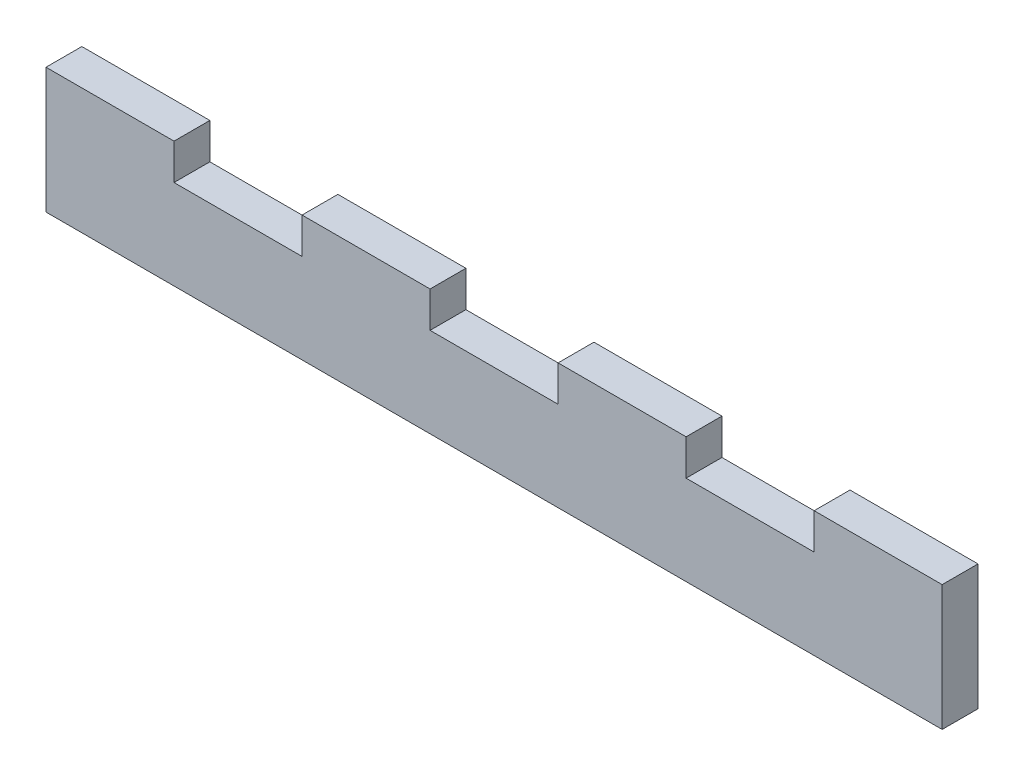
ISO-10303-21;
HEADER;
FILE_DESCRIPTION(('STEP AP214'),'2;1');
FILE_NAME('part.step','',(''),(''),'','','');
FILE_SCHEMA(('AUTOMOTIVE_DESIGN { 1 0 10303 214 1 1 1 1 }'));
ENDSEC;
DATA;
#1=APPLICATION_CONTEXT('core data for automotive mechanical design processes');
#2=APPLICATION_PROTOCOL_DEFINITION('international standard','automotive_design',2000,#1);
#3=PRODUCT_CONTEXT('',#1,'mechanical');
#4=PRODUCT('Part','Part','',(#3));
#5=PRODUCT_RELATED_PRODUCT_CATEGORY('part','',(#4));
#6=PRODUCT_DEFINITION_FORMATION('','',#4);
#7=PRODUCT_DEFINITION_CONTEXT('part definition',#1,'design');
#8=PRODUCT_DEFINITION('design','',#6,#7);
#9=PRODUCT_DEFINITION_SHAPE('','',#8);
#10=(LENGTH_UNIT() NAMED_UNIT(*) SI_UNIT(.MILLI.,.METRE.));
#11=(NAMED_UNIT(*) PLANE_ANGLE_UNIT() SI_UNIT($,.RADIAN.));
#12=(NAMED_UNIT(*) SI_UNIT($,.STERADIAN.) SOLID_ANGLE_UNIT());
#13=UNCERTAINTY_MEASURE_WITH_UNIT(LENGTH_MEASURE(1.E-05),#10,'distance_accuracy_value','');
#14=(GEOMETRIC_REPRESENTATION_CONTEXT(3) GLOBAL_UNCERTAINTY_ASSIGNED_CONTEXT((#13)) GLOBAL_UNIT_ASSIGNED_CONTEXT((#10,
#11,#12)) REPRESENTATION_CONTEXT('',''));
#15=CARTESIAN_POINT('',(0.,0.,0.));
#16=DIRECTION('',(0.,0.,1.));
#17=DIRECTION('',(1.,0.,0.));
#18=AXIS2_PLACEMENT_3D('',#15,#16,#17);
#19=CARTESIAN_POINT('',(63.5,8.89000000000001,5.08));
#20=DIRECTION('',(0.,-1.,0.));
#21=DIRECTION('',(1.,0.,0.));
#22=AXIS2_PLACEMENT_3D('',#19,#20,#21);
#23=PLANE('',#22);
#24=DIRECTION('',(-1.,0.,0.));
#25=VECTOR('',#24,1.);
#26=CARTESIAN_POINT('',(63.5,8.89000000000001,0.));
#27=LINE('',#26,#25);
#28=CARTESIAN_POINT('',(63.5,8.89000000000001,0.));
#29=VERTEX_POINT('',#28);
#30=CARTESIAN_POINT('',(45.3571428571429,8.89,0.));
#31=VERTEX_POINT('',#30);
#32=EDGE_CURVE('E226',#29,#31,#27,.T.);
#33=ORIENTED_EDGE('',*,*,#32,.T.);
#34=DIRECTION('',(0.,0.,-1.));
#35=VECTOR('',#34,1.);
#36=CARTESIAN_POINT('',(45.3571428571429,8.89,5.08));
#37=LINE('',#36,#35);
#38=CARTESIAN_POINT('',(45.3571428571429,8.89,5.08));
#39=VERTEX_POINT('',#38);
#40=EDGE_CURVE('E191',#39,#31,#37,.T.);
#41=ORIENTED_EDGE('',*,*,#40,.F.);
#42=DIRECTION('',(-1.,0.,0.));
#43=VECTOR('',#42,1.);
#44=CARTESIAN_POINT('',(63.5,8.89000000000001,5.08));
#45=LINE('',#44,#43);
#46=CARTESIAN_POINT('',(63.5,8.89000000000001,5.08));
#47=VERTEX_POINT('',#46);
#48=EDGE_CURVE('E231',#47,#39,#45,.T.);
#49=ORIENTED_EDGE('',*,*,#48,.F.);
#50=DIRECTION('',(0.,0.,-1.));
#51=VECTOR('',#50,1.);
#52=CARTESIAN_POINT('',(63.5,8.89000000000001,5.08));
#53=LINE('',#52,#51);
#54=EDGE_CURVE('E248',#47,#29,#53,.T.);
#55=ORIENTED_EDGE('',*,*,#54,.T.);
#56=EDGE_LOOP('',(#33,#41,#49,#55));
#57=FACE_BOUND('',#56,.T.);
#58=ADVANCED_FACE('F33',(#57),#23,.F.);
#59=CARTESIAN_POINT('',(27.2142857142857,8.89,5.08));
#60=VERTEX_POINT('',#59);
#61=CARTESIAN_POINT('',(9.0714285714286,8.89,5.08));
#62=VERTEX_POINT('',#61);
#63=EDGE_CURVE('E235',#60,#62,#45,.T.);
#64=ORIENTED_EDGE('',*,*,#63,.F.);
#65=DIRECTION('',(0.,0.,1.));
#66=VECTOR('',#65,1.);
#67=CARTESIAN_POINT('',(27.2142857142857,8.89,5.08));
#68=LINE('',#67,#66);
#69=CARTESIAN_POINT('',(27.2142857142857,8.89,0.));
#70=VERTEX_POINT('',#69);
#71=EDGE_CURVE('E287',#70,#60,#68,.T.);
#72=ORIENTED_EDGE('',*,*,#71,.F.);
#73=CARTESIAN_POINT('',(9.07142857142859,8.89,0.));
#74=VERTEX_POINT('',#73);
#75=EDGE_CURVE('E167',#70,#74,#27,.T.);
#76=ORIENTED_EDGE('',*,*,#75,.T.);
#77=DIRECTION('',(0.,0.,-1.));
#78=VECTOR('',#77,1.);
#79=CARTESIAN_POINT('',(9.0714285714286,8.89,5.08));
#80=LINE('',#79,#78);
#81=EDGE_CURVE('E185',#62,#74,#80,.T.);
#82=ORIENTED_EDGE('',*,*,#81,.F.);
#83=EDGE_LOOP('',(#64,#72,#76,#82));
#84=FACE_BOUND('',#83,.T.);
#85=ADVANCED_FACE('F285',(#84),#23,.F.);
#86=CARTESIAN_POINT('',(-9.07142857142854,8.89,5.08));
#87=VERTEX_POINT('',#86);
#88=CARTESIAN_POINT('',(-27.2142857142857,8.88999999999999,5.08));
#89=VERTEX_POINT('',#88);
#90=EDGE_CURVE('E296',#87,#89,#45,.T.);
#91=ORIENTED_EDGE('',*,*,#90,.F.);
#92=DIRECTION('',(0.,0.,1.));
#93=VECTOR('',#92,1.);
#94=CARTESIAN_POINT('',(-9.07142857142854,8.89,5.08));
#95=LINE('',#94,#93);
#96=CARTESIAN_POINT('',(-9.07142857142856,8.89,0.));
#97=VERTEX_POINT('',#96);
#98=EDGE_CURVE('E177',#97,#87,#95,.T.);
#99=ORIENTED_EDGE('',*,*,#98,.F.);
#100=CARTESIAN_POINT('',(-27.2142857142857,8.88999999999999,0.));
#101=VERTEX_POINT('',#100);
#102=EDGE_CURVE('E276',#97,#101,#27,.T.);
#103=ORIENTED_EDGE('',*,*,#102,.T.);
#104=DIRECTION('',(0.,0.,-1.));
#105=VECTOR('',#104,1.);
#106=CARTESIAN_POINT('',(-27.2142857142857,8.88999999999999,5.08));
#107=LINE('',#106,#105);
#108=EDGE_CURVE('E211',#89,#101,#107,.T.);
#109=ORIENTED_EDGE('',*,*,#108,.F.);
#110=EDGE_LOOP('',(#91,#99,#103,#109));
#111=FACE_BOUND('',#110,.T.);
#112=ADVANCED_FACE('F305',(#111),#23,.F.);
#113=CARTESIAN_POINT('',(-63.5,-8.89000000000001,5.08));
#114=DIRECTION('',(1.,0.,0.));
#115=DIRECTION('',(0.,0.,-1.));
#116=AXIS2_PLACEMENT_3D('',#113,#114,#115);
#117=PLANE('',#116);
#118=DIRECTION('',(0.,-1.,0.));
#119=VECTOR('',#118,1.);
#120=CARTESIAN_POINT('',(-63.5,-8.89000000000001,0.));
#121=LINE('',#120,#119);
#122=CARTESIAN_POINT('',(-63.5,8.88999999999999,0.));
#123=VERTEX_POINT('',#122);
#124=CARTESIAN_POINT('',(-63.5,-8.89000000000001,0.));
#125=VERTEX_POINT('',#124);
#126=EDGE_CURVE('E236',#123,#125,#121,.T.);
#127=ORIENTED_EDGE('',*,*,#126,.T.);
#128=DIRECTION('',(0.,0.,-1.));
#129=VECTOR('',#128,1.);
#130=CARTESIAN_POINT('',(-63.5,-8.89000000000001,5.08));
#131=LINE('',#130,#129);
#132=CARTESIAN_POINT('',(-63.5,-8.89000000000001,5.08));
#133=VERTEX_POINT('',#132);
#134=EDGE_CURVE('E11',#133,#125,#131,.T.);
#135=ORIENTED_EDGE('',*,*,#134,.F.);
#136=DIRECTION('',(0.,-1.,0.));
#137=VECTOR('',#136,1.);
#138=CARTESIAN_POINT('',(-63.5,-8.89000000000001,5.08));
#139=LINE('',#138,#137);
#140=CARTESIAN_POINT('',(-63.5,8.88999999999999,5.08));
#141=VERTEX_POINT('',#140);
#142=EDGE_CURVE('E222',#141,#133,#139,.T.);
#143=ORIENTED_EDGE('',*,*,#142,.F.);
#144=DIRECTION('',(0.,0.,-1.));
#145=VECTOR('',#144,1.);
#146=CARTESIAN_POINT('',(-63.5,8.88999999999999,5.08));
#147=LINE('',#146,#145);
#148=EDGE_CURVE('E234',#141,#123,#147,.T.);
#149=ORIENTED_EDGE('',*,*,#148,.T.);
#150=EDGE_LOOP('',(#127,#135,#143,#149));
#151=FACE_BOUND('',#150,.T.);
#152=ADVANCED_FACE('F35',(#151),#117,.F.);
#153=CARTESIAN_POINT('',(63.5,-8.88999999999999,5.08));
#154=DIRECTION('',(0.,1.,0.));
#155=DIRECTION('',(-1.,0.,0.));
#156=AXIS2_PLACEMENT_3D('',#153,#154,#155);
#157=PLANE('',#156);
#158=DIRECTION('',(1.,0.,0.));
#159=VECTOR('',#158,1.);
#160=CARTESIAN_POINT('',(63.5,-8.88999999999999,0.));
#161=LINE('',#160,#159);
#162=CARTESIAN_POINT('',(63.5,-8.88999999999999,0.));
#163=VERTEX_POINT('',#162);
#164=EDGE_CURVE('E239',#125,#163,#161,.T.);
#165=ORIENTED_EDGE('',*,*,#164,.T.);
#166=DIRECTION('',(0.,0.,-1.));
#167=VECTOR('',#166,1.);
#168=CARTESIAN_POINT('',(63.5,-8.88999999999999,5.08));
#169=LINE('',#168,#167);
#170=CARTESIAN_POINT('',(63.5,-8.88999999999999,5.08));
#171=VERTEX_POINT('',#170);
#172=EDGE_CURVE('E41',#171,#163,#169,.T.);
#173=ORIENTED_EDGE('',*,*,#172,.F.);
#174=DIRECTION('',(1.,0.,0.));
#175=VECTOR('',#174,1.);
#176=CARTESIAN_POINT('',(63.5,-8.88999999999999,5.08));
#177=LINE('',#176,#175);
#178=EDGE_CURVE('E225',#133,#171,#177,.T.);
#179=ORIENTED_EDGE('',*,*,#178,.F.);
#180=ORIENTED_EDGE('',*,*,#134,.T.);
#181=EDGE_LOOP('',(#165,#173,#179,#180));
#182=FACE_BOUND('',#181,.T.);
#183=ADVANCED_FACE('F268',(#182),#157,.F.);
#184=CARTESIAN_POINT('',(63.5,-8.88999999999999,5.08));
#185=DIRECTION('',(-1.,0.,0.));
#186=DIRECTION('',(0.,0.,1.));
#187=AXIS2_PLACEMENT_3D('',#184,#185,#186);
#188=PLANE('',#187);
#189=DIRECTION('',(0.,1.,0.));
#190=VECTOR('',#189,1.);
#191=CARTESIAN_POINT('',(63.5,-8.88999999999999,0.));
#192=LINE('',#191,#190);
#193=EDGE_CURVE('E241',#163,#29,#192,.T.);
#194=ORIENTED_EDGE('',*,*,#193,.T.);
#195=ORIENTED_EDGE('',*,*,#54,.F.);
#196=DIRECTION('',(0.,1.,0.));
#197=VECTOR('',#196,1.);
#198=CARTESIAN_POINT('',(63.5,-8.88999999999999,5.08));
#199=LINE('',#198,#197);
#200=EDGE_CURVE('E228',#171,#47,#199,.T.);
#201=ORIENTED_EDGE('',*,*,#200,.F.);
#202=ORIENTED_EDGE('',*,*,#172,.T.);
#203=EDGE_LOOP('',(#194,#195,#201,#202));
#204=FACE_BOUND('',#203,.T.);
#205=ADVANCED_FACE('F255',(#204),#188,.F.);
#206=CARTESIAN_POINT('',(-45.3571428571428,8.88999999999999,5.08));
#207=VERTEX_POINT('',#206);
#208=EDGE_CURVE('E230',#207,#141,#45,.T.);
#209=ORIENTED_EDGE('',*,*,#208,.F.);
#210=DIRECTION('',(0.,0.,1.));
#211=VECTOR('',#210,1.);
#212=CARTESIAN_POINT('',(-45.3571428571428,8.88999999999999,5.08));
#213=LINE('',#212,#211);
#214=CARTESIAN_POINT('',(-45.3571428571428,8.88999999999999,0.));
#215=VERTEX_POINT('',#214);
#216=EDGE_CURVE('E201',#215,#207,#213,.T.);
#217=ORIENTED_EDGE('',*,*,#216,.F.);
#218=EDGE_CURVE('E243',#215,#123,#27,.T.);
#219=ORIENTED_EDGE('',*,*,#218,.T.);
#220=ORIENTED_EDGE('',*,*,#148,.F.);
#221=EDGE_LOOP('',(#209,#217,#219,#220));
#222=FACE_BOUND('',#221,.T.);
#223=ADVANCED_FACE('F302',(#222),#23,.F.);
#224=CARTESIAN_POINT('',(0.,0.,5.08));
#225=DIRECTION('',(0.,0.,1.));
#226=DIRECTION('',(1.,0.,0.));
#227=AXIS2_PLACEMENT_3D('',#224,#225,#226);
#228=PLANE('',#227);
#229=DIRECTION('',(0.,1.,0.));
#230=VECTOR('',#229,1.);
#231=CARTESIAN_POINT('',(45.3571428571429,3.81,5.08));
#232=LINE('',#231,#230);
#233=CARTESIAN_POINT('',(45.3571428571429,3.81,5.08));
#234=VERTEX_POINT('',#233);
#235=EDGE_CURVE('E170',#234,#39,#232,.T.);
#236=ORIENTED_EDGE('',*,*,#235,.F.);
#237=DIRECTION('',(1.,0.,0.));
#238=VECTOR('',#237,1.);
#239=CARTESIAN_POINT('',(45.3571428571429,3.81,5.08));
#240=LINE('',#239,#238);
#241=CARTESIAN_POINT('',(27.2142857142857,3.81,5.08));
#242=VERTEX_POINT('',#241);
#243=EDGE_CURVE('E155',#242,#234,#240,.T.);
#244=ORIENTED_EDGE('',*,*,#243,.F.);
#245=DIRECTION('',(0.,1.,0.));
#246=VECTOR('',#245,1.);
#247=CARTESIAN_POINT('',(27.2142857142857,3.81,5.08));
#248=LINE('',#247,#246);
#249=EDGE_CURVE('E153',#242,#60,#248,.T.);
#250=ORIENTED_EDGE('',*,*,#249,.T.);
#251=ORIENTED_EDGE('',*,*,#63,.T.);
#252=DIRECTION('',(0.,1.,0.));
#253=VECTOR('',#252,1.);
#254=CARTESIAN_POINT('',(9.0714285714286,3.81,5.08));
#255=LINE('',#254,#253);
#256=CARTESIAN_POINT('',(9.0714285714286,3.81,5.08));
#257=VERTEX_POINT('',#256);
#258=EDGE_CURVE('E189',#257,#62,#255,.T.);
#259=ORIENTED_EDGE('',*,*,#258,.F.);
#260=DIRECTION('',(1.,0.,0.));
#261=VECTOR('',#260,1.);
#262=CARTESIAN_POINT('',(9.0714285714286,3.81,5.08));
#263=LINE('',#262,#261);
#264=CARTESIAN_POINT('',(-9.07142857142854,3.80999999999999,5.08));
#265=VERTEX_POINT('',#264);
#266=EDGE_CURVE('E182',#265,#257,#263,.T.);
#267=ORIENTED_EDGE('',*,*,#266,.F.);
#268=DIRECTION('',(0.,1.,0.));
#269=VECTOR('',#268,1.);
#270=CARTESIAN_POINT('',(-9.07142857142854,3.80999999999999,5.08));
#271=LINE('',#270,#269);
#272=EDGE_CURVE('E192',#265,#87,#271,.T.);
#273=ORIENTED_EDGE('',*,*,#272,.T.);
#274=ORIENTED_EDGE('',*,*,#90,.T.);
#275=DIRECTION('',(0.,1.,0.));
#276=VECTOR('',#275,1.);
#277=CARTESIAN_POINT('',(-27.2142857142857,3.80999999999999,5.08));
#278=LINE('',#277,#276);
#279=CARTESIAN_POINT('',(-27.2142857142857,3.80999999999999,5.08));
#280=VERTEX_POINT('',#279);
#281=EDGE_CURVE('E187',#280,#89,#278,.T.);
#282=ORIENTED_EDGE('',*,*,#281,.F.);
#283=DIRECTION('',(1.,0.,0.));
#284=VECTOR('',#283,1.);
#285=CARTESIAN_POINT('',(-27.2142857142857,3.80999999999999,5.08));
#286=LINE('',#285,#284);
#287=CARTESIAN_POINT('',(-45.3571428571428,3.80999999999999,5.08));
#288=VERTEX_POINT('',#287);
#289=EDGE_CURVE('E207',#288,#280,#286,.T.);
#290=ORIENTED_EDGE('',*,*,#289,.F.);
#291=DIRECTION('',(0.,1.,0.));
#292=VECTOR('',#291,1.);
#293=CARTESIAN_POINT('',(-45.3571428571428,3.80999999999999,5.08));
#294=LINE('',#293,#292);
#295=EDGE_CURVE('E215',#288,#207,#294,.T.);
#296=ORIENTED_EDGE('',*,*,#295,.T.);
#297=ORIENTED_EDGE('',*,*,#208,.T.);
#298=ORIENTED_EDGE('',*,*,#142,.T.);
#299=ORIENTED_EDGE('',*,*,#178,.T.);
#300=ORIENTED_EDGE('',*,*,#200,.T.);
#301=ORIENTED_EDGE('',*,*,#48,.T.);
#302=EDGE_LOOP('',(#236,#244,#250,#251,#259,#267,#273,#274,#282,#290,#296,#297,#298,#299,#300,#301));
#303=FACE_BOUND('',#302,.T.);
#304=ADVANCED_FACE('F265',(#303),#228,.T.);
#305=CARTESIAN_POINT('',(0.,0.,0.));
#306=DIRECTION('',(0.,0.,1.));
#307=DIRECTION('',(1.,0.,0.));
#308=AXIS2_PLACEMENT_3D('',#305,#306,#307);
#309=PLANE('',#308);
#310=DIRECTION('',(-1.,0.,0.));
#311=VECTOR('',#310,1.);
#312=CARTESIAN_POINT('',(45.3571428571429,3.81,0.));
#313=LINE('',#312,#311);
#314=CARTESIAN_POINT('',(45.3571428571429,3.81,0.));
#315=VERTEX_POINT('',#314);
#316=CARTESIAN_POINT('',(27.2142857142857,3.81,0.));
#317=VERTEX_POINT('',#316);
#318=EDGE_CURVE('E156',#315,#317,#313,.T.);
#319=ORIENTED_EDGE('',*,*,#318,.F.);
#320=DIRECTION('',(0.,1.,0.));
#321=VECTOR('',#320,1.);
#322=CARTESIAN_POINT('',(45.3571428571429,3.81,0.));
#323=LINE('',#322,#321);
#324=EDGE_CURVE('E168',#315,#31,#323,.T.);
#325=ORIENTED_EDGE('',*,*,#324,.T.);
#326=ORIENTED_EDGE('',*,*,#32,.F.);
#327=ORIENTED_EDGE('',*,*,#193,.F.);
#328=ORIENTED_EDGE('',*,*,#164,.F.);
#329=ORIENTED_EDGE('',*,*,#126,.F.);
#330=ORIENTED_EDGE('',*,*,#218,.F.);
#331=DIRECTION('',(0.,1.,0.));
#332=VECTOR('',#331,1.);
#333=CARTESIAN_POINT('',(-45.3571428571428,3.80999999999999,0.));
#334=LINE('',#333,#332);
#335=CARTESIAN_POINT('',(-45.3571428571428,3.80999999999999,0.));
#336=VERTEX_POINT('',#335);
#337=EDGE_CURVE('E218',#336,#215,#334,.T.);
#338=ORIENTED_EDGE('',*,*,#337,.F.);
#339=DIRECTION('',(-1.,0.,0.));
#340=VECTOR('',#339,1.);
#341=CARTESIAN_POINT('',(-27.2142857142857,3.80999999999999,0.));
#342=LINE('',#341,#340);
#343=CARTESIAN_POINT('',(-27.2142857142857,3.80999999999999,0.));
#344=VERTEX_POINT('',#343);
#345=EDGE_CURVE('E200',#344,#336,#342,.T.);
#346=ORIENTED_EDGE('',*,*,#345,.F.);
#347=DIRECTION('',(0.,1.,0.));
#348=VECTOR('',#347,1.);
#349=CARTESIAN_POINT('',(-27.2142857142857,3.80999999999999,0.));
#350=LINE('',#349,#348);
#351=EDGE_CURVE('E210',#344,#101,#350,.T.);
#352=ORIENTED_EDGE('',*,*,#351,.T.);
#353=ORIENTED_EDGE('',*,*,#102,.F.);
#354=DIRECTION('',(0.,1.,0.));
#355=VECTOR('',#354,1.);
#356=CARTESIAN_POINT('',(-9.07142857142856,3.80999999999999,0.));
#357=LINE('',#356,#355);
#358=CARTESIAN_POINT('',(-9.07142857142856,3.80999999999999,0.));
#359=VERTEX_POINT('',#358);
#360=EDGE_CURVE('E195',#359,#97,#357,.T.);
#361=ORIENTED_EDGE('',*,*,#360,.F.);
#362=DIRECTION('',(-1.,0.,0.));
#363=VECTOR('',#362,1.);
#364=CARTESIAN_POINT('',(9.07142857142859,3.81,0.));
#365=LINE('',#364,#363);
#366=CARTESIAN_POINT('',(9.0714285714286,3.81,0.));
#367=VERTEX_POINT('',#366);
#368=EDGE_CURVE('E176',#367,#359,#365,.T.);
#369=ORIENTED_EDGE('',*,*,#368,.F.);
#370=DIRECTION('',(0.,1.,0.));
#371=VECTOR('',#370,1.);
#372=CARTESIAN_POINT('',(9.07142857142859,3.81,0.));
#373=LINE('',#372,#371);
#374=EDGE_CURVE('E184',#367,#74,#373,.T.);
#375=ORIENTED_EDGE('',*,*,#374,.T.);
#376=ORIENTED_EDGE('',*,*,#75,.F.);
#377=DIRECTION('',(0.,1.,0.));
#378=VECTOR('',#377,1.);
#379=CARTESIAN_POINT('',(27.2142857142857,3.81,0.));
#380=LINE('',#379,#378);
#381=EDGE_CURVE('E150',#317,#70,#380,.T.);
#382=ORIENTED_EDGE('',*,*,#381,.F.);
#383=EDGE_LOOP('',(#319,#325,#326,#327,#328,#329,#330,#338,#346,#352,#353,#361,#369,#375,#376,#382));
#384=FACE_BOUND('',#383,.T.);
#385=ADVANCED_FACE('F164',(#384),#309,.F.);
#386=CARTESIAN_POINT('',(-27.2142857142857,3.80999999999999,5.08));
#387=DIRECTION('',(1.,0.,0.));
#388=DIRECTION('',(0.,0.,-1.));
#389=AXIS2_PLACEMENT_3D('',#386,#387,#388);
#390=PLANE('',#389);
#391=ORIENTED_EDGE('',*,*,#108,.T.);
#392=ORIENTED_EDGE('',*,*,#351,.F.);
#393=DIRECTION('',(0.,0.,-1.));
#394=VECTOR('',#393,1.);
#395=CARTESIAN_POINT('',(-27.2142857142857,3.80999999999999,5.08));
#396=LINE('',#395,#394);
#397=EDGE_CURVE('E198',#280,#344,#396,.T.);
#398=ORIENTED_EDGE('',*,*,#397,.F.);
#399=ORIENTED_EDGE('',*,*,#281,.T.);
#400=EDGE_LOOP('',(#391,#392,#398,#399));
#401=FACE_BOUND('',#400,.T.);
#402=ADVANCED_FACE('F321',(#401),#390,.F.);
#403=CARTESIAN_POINT('',(-45.3571428571428,3.80999999999999,5.08));
#404=DIRECTION('',(-1.,0.,0.));
#405=DIRECTION('',(0.,0.,1.));
#406=AXIS2_PLACEMENT_3D('',#403,#404,#405);
#407=PLANE('',#406);
#408=ORIENTED_EDGE('',*,*,#216,.T.);
#409=ORIENTED_EDGE('',*,*,#295,.F.);
#410=DIRECTION('',(0.,0.,1.));
#411=VECTOR('',#410,1.);
#412=CARTESIAN_POINT('',(-45.3571428571428,3.80999999999999,5.08));
#413=LINE('',#412,#411);
#414=EDGE_CURVE('E204',#336,#288,#413,.T.);
#415=ORIENTED_EDGE('',*,*,#414,.F.);
#416=ORIENTED_EDGE('',*,*,#337,.T.);
#417=EDGE_LOOP('',(#408,#409,#415,#416));
#418=FACE_BOUND('',#417,.T.);
#419=ADVANCED_FACE('F326',(#418),#407,.F.);
#420=CARTESIAN_POINT('',(0.,3.80999999999999,0.));
#421=DIRECTION('',(0.,1.,0.));
#422=DIRECTION('',(-1.,0.,0.));
#423=AXIS2_PLACEMENT_3D('',#420,#421,#422);
#424=PLANE('',#423);
#425=ORIENTED_EDGE('',*,*,#397,.T.);
#426=ORIENTED_EDGE('',*,*,#345,.T.);
#427=ORIENTED_EDGE('',*,*,#414,.T.);
#428=ORIENTED_EDGE('',*,*,#289,.T.);
#429=EDGE_LOOP('',(#425,#426,#427,#428));
#430=FACE_BOUND('',#429,.T.);
#431=ADVANCED_FACE('F324',(#430),#424,.T.);
#432=CARTESIAN_POINT('',(9.0714285714286,3.81,5.08));
#433=DIRECTION('',(1.,0.,0.));
#434=DIRECTION('',(0.,0.,-1.));
#435=AXIS2_PLACEMENT_3D('',#432,#433,#434);
#436=PLANE('',#435);
#437=ORIENTED_EDGE('',*,*,#81,.T.);
#438=ORIENTED_EDGE('',*,*,#374,.F.);
#439=DIRECTION('',(0.,0.,-1.));
#440=VECTOR('',#439,1.);
#441=CARTESIAN_POINT('',(9.0714285714286,3.81,5.08));
#442=LINE('',#441,#440);
#443=EDGE_CURVE('E56',#257,#367,#442,.T.);
#444=ORIENTED_EDGE('',*,*,#443,.F.);
#445=ORIENTED_EDGE('',*,*,#258,.T.);
#446=EDGE_LOOP('',(#437,#438,#444,#445));
#447=FACE_BOUND('',#446,.T.);
#448=ADVANCED_FACE('F333',(#447),#436,.F.);
#449=CARTESIAN_POINT('',(-9.07142857142854,3.80999999999999,5.08));
#450=DIRECTION('',(-1.,0.,0.));
#451=DIRECTION('',(0.,0.,1.));
#452=AXIS2_PLACEMENT_3D('',#449,#450,#451);
#453=PLANE('',#452);
#454=ORIENTED_EDGE('',*,*,#98,.T.);
#455=ORIENTED_EDGE('',*,*,#272,.F.);
#456=DIRECTION('',(0.,0.,1.));
#457=VECTOR('',#456,1.);
#458=CARTESIAN_POINT('',(-9.07142857142854,3.80999999999999,5.08));
#459=LINE('',#458,#457);
#460=EDGE_CURVE('E179',#359,#265,#459,.T.);
#461=ORIENTED_EDGE('',*,*,#460,.F.);
#462=ORIENTED_EDGE('',*,*,#360,.T.);
#463=EDGE_LOOP('',(#454,#455,#461,#462));
#464=FACE_BOUND('',#463,.T.);
#465=ADVANCED_FACE('F366',(#464),#453,.F.);
#466=CARTESIAN_POINT('',(0.,3.81,0.));
#467=DIRECTION('',(0.,1.,0.));
#468=DIRECTION('',(-1.,0.,0.));
#469=AXIS2_PLACEMENT_3D('',#466,#467,#468);
#470=PLANE('',#469);
#471=ORIENTED_EDGE('',*,*,#443,.T.);
#472=ORIENTED_EDGE('',*,*,#368,.T.);
#473=ORIENTED_EDGE('',*,*,#460,.T.);
#474=ORIENTED_EDGE('',*,*,#266,.T.);
#475=EDGE_LOOP('',(#471,#472,#473,#474));
#476=FACE_BOUND('',#475,.T.);
#477=ADVANCED_FACE('F375',(#476),#470,.T.);
#478=CARTESIAN_POINT('',(45.3571428571429,3.81,5.08));
#479=DIRECTION('',(1.,0.,0.));
#480=DIRECTION('',(0.,0.,-1.));
#481=AXIS2_PLACEMENT_3D('',#478,#479,#480);
#482=PLANE('',#481);
#483=ORIENTED_EDGE('',*,*,#40,.T.);
#484=ORIENTED_EDGE('',*,*,#324,.F.);
#485=DIRECTION('',(0.,0.,-1.));
#486=VECTOR('',#485,1.);
#487=CARTESIAN_POINT('',(45.3571428571429,3.81,5.08));
#488=LINE('',#487,#486);
#489=EDGE_CURVE('E48',#234,#315,#488,.T.);
#490=ORIENTED_EDGE('',*,*,#489,.F.);
#491=ORIENTED_EDGE('',*,*,#235,.T.);
#492=EDGE_LOOP('',(#483,#484,#490,#491));
#493=FACE_BOUND('',#492,.T.);
#494=ADVANCED_FACE('F293',(#493),#482,.F.);
#495=CARTESIAN_POINT('',(27.2142857142857,3.81,5.08));
#496=DIRECTION('',(-1.,0.,0.));
#497=DIRECTION('',(0.,0.,1.));
#498=AXIS2_PLACEMENT_3D('',#495,#496,#497);
#499=PLANE('',#498);
#500=ORIENTED_EDGE('',*,*,#71,.T.);
#501=ORIENTED_EDGE('',*,*,#249,.F.);
#502=DIRECTION('',(0.,0.,1.));
#503=VECTOR('',#502,1.);
#504=CARTESIAN_POINT('',(27.2142857142857,3.81,5.08));
#505=LINE('',#504,#503);
#506=EDGE_CURVE('E147',#317,#242,#505,.T.);
#507=ORIENTED_EDGE('',*,*,#506,.F.);
#508=ORIENTED_EDGE('',*,*,#381,.T.);
#509=EDGE_LOOP('',(#500,#501,#507,#508));
#510=FACE_BOUND('',#509,.T.);
#511=ADVANCED_FACE('F148',(#510),#499,.F.);
#512=CARTESIAN_POINT('',(0.,3.81,0.));
#513=DIRECTION('',(0.,1.,0.));
#514=DIRECTION('',(-1.,0.,0.));
#515=AXIS2_PLACEMENT_3D('',#512,#513,#514);
#516=PLANE('',#515);
#517=ORIENTED_EDGE('',*,*,#489,.T.);
#518=ORIENTED_EDGE('',*,*,#318,.T.);
#519=ORIENTED_EDGE('',*,*,#506,.T.);
#520=ORIENTED_EDGE('',*,*,#243,.T.);
#521=EDGE_LOOP('',(#517,#518,#519,#520));
#522=FACE_BOUND('',#521,.T.);
#523=ADVANCED_FACE('F159',(#522),#516,.T.);
#524=CLOSED_SHELL('',(#58,#85,#112,#152,#183,#205,#223,#304,#385,#402,#419,#431,#448,#465,#477,
#494,#511,#523));
#525=MANIFOLD_SOLID_BREP('B2',#524);
#526=ADVANCED_BREP_SHAPE_REPRESENTATION('',(#18,#525),#14);
#527=SHAPE_DEFINITION_REPRESENTATION(#9,#526);
ENDSEC;
END-ISO-10303-21;
